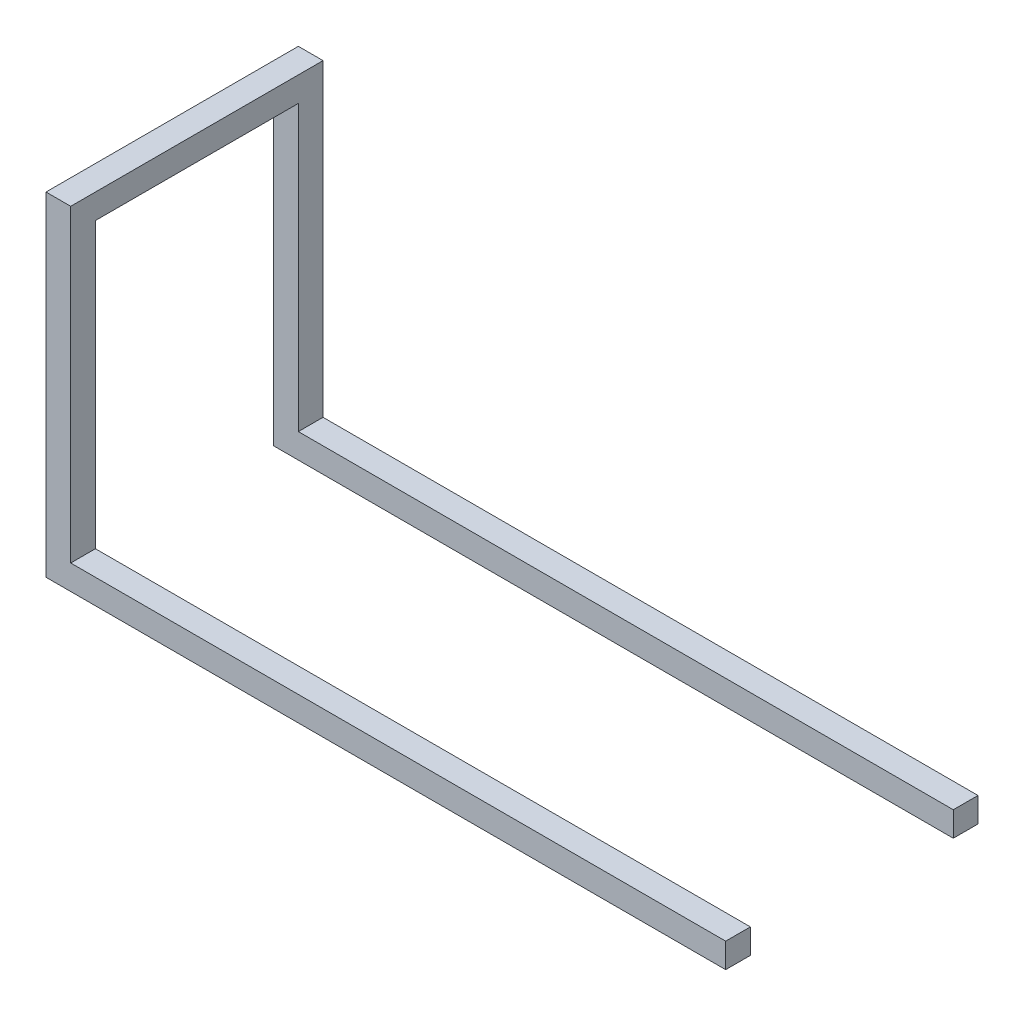
ISO-10303-21;
HEADER;
FILE_DESCRIPTION(('STEP AP214'),'2;1');
FILE_NAME('part.step','',(''),(''),'','','');
FILE_SCHEMA(('AUTOMOTIVE_DESIGN { 1 0 10303 214 1 1 1 1 }'));
ENDSEC;
DATA;
#1=APPLICATION_CONTEXT('core data for automotive mechanical design processes');
#2=APPLICATION_PROTOCOL_DEFINITION('international standard','automotive_design',2000,#1);
#3=PRODUCT_CONTEXT('',#1,'mechanical');
#4=PRODUCT('Part','Part','',(#3));
#5=PRODUCT_RELATED_PRODUCT_CATEGORY('part','',(#4));
#6=PRODUCT_DEFINITION_FORMATION('','',#4);
#7=PRODUCT_DEFINITION_CONTEXT('part definition',#1,'design');
#8=PRODUCT_DEFINITION('design','',#6,#7);
#9=PRODUCT_DEFINITION_SHAPE('','',#8);
#10=(LENGTH_UNIT() NAMED_UNIT(*) SI_UNIT(.MILLI.,.METRE.));
#11=(NAMED_UNIT(*) PLANE_ANGLE_UNIT() SI_UNIT($,.RADIAN.));
#12=(NAMED_UNIT(*) SI_UNIT($,.STERADIAN.) SOLID_ANGLE_UNIT());
#13=UNCERTAINTY_MEASURE_WITH_UNIT(LENGTH_MEASURE(1.E-05),#10,'distance_accuracy_value','');
#14=(GEOMETRIC_REPRESENTATION_CONTEXT(3) GLOBAL_UNCERTAINTY_ASSIGNED_CONTEXT((#13)) GLOBAL_UNIT_ASSIGNED_CONTEXT((#10,
#11,#12)) REPRESENTATION_CONTEXT('',''));
#15=CARTESIAN_POINT('',(0.,0.,0.));
#16=DIRECTION('',(0.,0.,1.));
#17=DIRECTION('',(1.,0.,0.));
#18=AXIS2_PLACEMENT_3D('',#15,#16,#17);
#19=CARTESIAN_POINT('',(0.,0.,164.2));
#20=DIRECTION('',(0.,0.,-1.));
#21=DIRECTION('',(-1.,0.,0.));
#22=AXIS2_PLACEMENT_3D('',#19,#20,#21);
#23=PLANE('',#22);
#24=DIRECTION('',(0.,-1.,0.));
#25=VECTOR('',#24,1.);
#26=CARTESIAN_POINT('',(-515.,500.,164.2));
#27=LINE('',#26,#25);
#28=CARTESIAN_POINT('',(-515.,460.,164.2));
#29=VERTEX_POINT('',#28);
#30=CARTESIAN_POINT('',(-515.,-39.9999999999999,164.2));
#31=VERTEX_POINT('',#30);
#32=EDGE_CURVE('E140',#29,#31,#27,.T.);
#33=ORIENTED_EDGE('',*,*,#32,.F.);
#34=DIRECTION('',(1.,0.,0.));
#35=VECTOR('',#34,1.);
#36=CARTESIAN_POINT('',(0.,460.,164.2));
#37=LINE('',#36,#35);
#38=CARTESIAN_POINT('',(-475.,460.,164.2));
#39=VERTEX_POINT('',#38);
#40=EDGE_CURVE('E54',#29,#39,#37,.T.);
#41=ORIENTED_EDGE('',*,*,#40,.T.);
#42=DIRECTION('',(0.,1.,0.));
#43=VECTOR('',#42,1.);
#44=CARTESIAN_POINT('',(-475.,0.,164.2));
#45=LINE('',#44,#43);
#46=CARTESIAN_POINT('',(-475.,0.,164.2));
#47=VERTEX_POINT('',#46);
#48=EDGE_CURVE('E151',#47,#39,#45,.T.);
#49=ORIENTED_EDGE('',*,*,#48,.F.);
#50=DIRECTION('',(-1.,0.,0.));
#51=VECTOR('',#50,1.);
#52=CARTESIAN_POINT('',(-475.,0.,164.2));
#53=LINE('',#52,#51);
#54=CARTESIAN_POINT('',(585.,0.,164.2));
#55=VERTEX_POINT('',#54);
#56=EDGE_CURVE('E92',#55,#47,#53,.T.);
#57=ORIENTED_EDGE('',*,*,#56,.F.);
#58=DIRECTION('',(0.,1.,0.));
#59=VECTOR('',#58,1.);
#60=CARTESIAN_POINT('',(585.,-39.9999999999999,164.2));
#61=LINE('',#60,#59);
#62=CARTESIAN_POINT('',(585.,-39.9999999999999,164.2));
#63=VERTEX_POINT('',#62);
#64=EDGE_CURVE('E146',#63,#55,#61,.T.);
#65=ORIENTED_EDGE('',*,*,#64,.F.);
#66=DIRECTION('',(1.,0.,0.));
#67=VECTOR('',#66,1.);
#68=CARTESIAN_POINT('',(-515.,-39.9999999999999,164.2));
#69=LINE('',#68,#67);
#70=EDGE_CURVE('E123',#31,#63,#69,.T.);
#71=ORIENTED_EDGE('',*,*,#70,.F.);
#72=EDGE_LOOP('',(#33,#41,#49,#57,#65,#71));
#73=FACE_BOUND('',#72,.T.);
#74=ADVANCED_FACE('F45',(#73),#23,.T.);
#75=CARTESIAN_POINT('',(-515.,500.,204.2));
#76=DIRECTION('',(0.,-1.,0.));
#77=DIRECTION('',(0.,0.,-1.));
#78=AXIS2_PLACEMENT_3D('',#75,#76,#77);
#79=PLANE('',#78);
#80=DIRECTION('',(0.,0.,-1.));
#81=VECTOR('',#80,1.);
#82=CARTESIAN_POINT('',(-475.,500.,204.2));
#83=LINE('',#82,#81);
#84=CARTESIAN_POINT('',(-475.,500.,204.2));
#85=VERTEX_POINT('',#84);
#86=CARTESIAN_POINT('',(-475.,500.,-204.2));
#87=VERTEX_POINT('',#86);
#88=EDGE_CURVE('E165',#85,#87,#83,.T.);
#89=ORIENTED_EDGE('',*,*,#88,.T.);
#90=DIRECTION('',(-1.,0.,0.));
#91=VECTOR('',#90,1.);
#92=CARTESIAN_POINT('',(-475.,500.,-204.2));
#93=LINE('',#92,#91);
#94=CARTESIAN_POINT('',(-515.,500.,-204.2));
#95=VERTEX_POINT('',#94);
#96=EDGE_CURVE('E250',#87,#95,#93,.T.);
#97=ORIENTED_EDGE('',*,*,#96,.T.);
#98=DIRECTION('',(0.,0.,-1.));
#99=VECTOR('',#98,1.);
#100=CARTESIAN_POINT('',(-515.,500.,204.2));
#101=LINE('',#100,#99);
#102=CARTESIAN_POINT('',(-515.,500.,204.2));
#103=VERTEX_POINT('',#102);
#104=EDGE_CURVE('E161',#103,#95,#101,.T.);
#105=ORIENTED_EDGE('',*,*,#104,.F.);
#106=DIRECTION('',(-1.,0.,0.));
#107=VECTOR('',#106,1.);
#108=CARTESIAN_POINT('',(-515.,500.,204.2));
#109=LINE('',#108,#107);
#110=EDGE_CURVE('E262',#85,#103,#109,.T.);
#111=ORIENTED_EDGE('',*,*,#110,.F.);
#112=EDGE_LOOP('',(#89,#97,#105,#111));
#113=FACE_BOUND('',#112,.T.);
#114=ADVANCED_FACE('F47',(#113),#79,.F.);
#115=CARTESIAN_POINT('',(-515.,500.,204.2));
#116=DIRECTION('',(1.,0.,0.));
#117=DIRECTION('',(0.,0.,-1.));
#118=AXIS2_PLACEMENT_3D('',#115,#116,#117);
#119=PLANE('',#118);
#120=ORIENTED_EDGE('',*,*,#104,.T.);
#121=DIRECTION('',(0.,1.,0.));
#122=VECTOR('',#121,1.);
#123=CARTESIAN_POINT('',(-515.,460.,-204.2));
#124=LINE('',#123,#122);
#125=CARTESIAN_POINT('',(-515.,-39.9999999999999,-204.2));
#126=VERTEX_POINT('',#125);
#127=EDGE_CURVE('E143',#126,#95,#124,.T.);
#128=ORIENTED_EDGE('',*,*,#127,.F.);
#129=DIRECTION('',(0.,0.,1.));
#130=VECTOR('',#129,1.);
#131=CARTESIAN_POINT('',(-515.,-39.9999999999999,-204.2));
#132=LINE('',#131,#130);
#133=CARTESIAN_POINT('',(-515.,-39.9999999999999,-164.2));
#134=VERTEX_POINT('',#133);
#135=EDGE_CURVE('E239',#126,#134,#132,.T.);
#136=ORIENTED_EDGE('',*,*,#135,.T.);
#137=DIRECTION('',(0.,-1.,0.));
#138=VECTOR('',#137,1.);
#139=CARTESIAN_POINT('',(-515.,500.,-164.2));
#140=LINE('',#139,#138);
#141=CARTESIAN_POINT('',(-515.,460.,-164.2));
#142=VERTEX_POINT('',#141);
#143=EDGE_CURVE('E228',#142,#134,#140,.T.);
#144=ORIENTED_EDGE('',*,*,#143,.F.);
#145=DIRECTION('',(0.,0.,1.));
#146=VECTOR('',#145,1.);
#147=CARTESIAN_POINT('',(-515.,460.,-204.2));
#148=LINE('',#147,#146);
#149=EDGE_CURVE('E236',#142,#29,#148,.T.);
#150=ORIENTED_EDGE('',*,*,#149,.T.);
#151=ORIENTED_EDGE('',*,*,#32,.T.);
#152=DIRECTION('',(0.,0.,-1.));
#153=VECTOR('',#152,1.);
#154=CARTESIAN_POINT('',(-515.,-39.9999999999999,204.2));
#155=LINE('',#154,#153);
#156=CARTESIAN_POINT('',(-515.,-39.9999999999999,204.2));
#157=VERTEX_POINT('',#156);
#158=EDGE_CURVE('E127',#157,#31,#155,.T.);
#159=ORIENTED_EDGE('',*,*,#158,.F.);
#160=DIRECTION('',(0.,-1.,0.));
#161=VECTOR('',#160,1.);
#162=CARTESIAN_POINT('',(-515.,500.,204.2));
#163=LINE('',#162,#161);
#164=EDGE_CURVE('E113',#103,#157,#163,.T.);
#165=ORIENTED_EDGE('',*,*,#164,.F.);
#166=EDGE_LOOP('',(#120,#128,#136,#144,#150,#151,#159,#165));
#167=FACE_BOUND('',#166,.T.);
#168=ADVANCED_FACE('F195',(#167),#119,.F.);
#169=CARTESIAN_POINT('',(-515.,-39.9999999999999,204.2));
#170=DIRECTION('',(0.,1.,0.));
#171=DIRECTION('',(-1.,0.,0.));
#172=AXIS2_PLACEMENT_3D('',#169,#170,#171);
#173=PLANE('',#172);
#174=ORIENTED_EDGE('',*,*,#70,.T.);
#175=DIRECTION('',(0.,0.,-1.));
#176=VECTOR('',#175,1.);
#177=CARTESIAN_POINT('',(585.,-39.9999999999999,204.2));
#178=LINE('',#177,#176);
#179=CARTESIAN_POINT('',(585.,-39.9999999999999,204.2));
#180=VERTEX_POINT('',#179);
#181=EDGE_CURVE('E120',#180,#63,#178,.T.);
#182=ORIENTED_EDGE('',*,*,#181,.F.);
#183=DIRECTION('',(1.,0.,0.));
#184=VECTOR('',#183,1.);
#185=CARTESIAN_POINT('',(-515.,-39.9999999999999,204.2));
#186=LINE('',#185,#184);
#187=EDGE_CURVE('E106',#157,#180,#186,.T.);
#188=ORIENTED_EDGE('',*,*,#187,.F.);
#189=ORIENTED_EDGE('',*,*,#158,.T.);
#190=EDGE_LOOP('',(#174,#182,#188,#189));
#191=FACE_BOUND('',#190,.T.);
#192=ADVANCED_FACE('F121',(#191),#173,.F.);
#193=CARTESIAN_POINT('',(585.,-39.9999999999999,204.2));
#194=DIRECTION('',(-1.,0.,0.));
#195=DIRECTION('',(0.,0.,1.));
#196=AXIS2_PLACEMENT_3D('',#193,#194,#195);
#197=PLANE('',#196);
#198=ORIENTED_EDGE('',*,*,#64,.T.);
#199=DIRECTION('',(0.,0.,-1.));
#200=VECTOR('',#199,1.);
#201=CARTESIAN_POINT('',(585.,0.,204.2));
#202=LINE('',#201,#200);
#203=CARTESIAN_POINT('',(585.,0.,204.2));
#204=VERTEX_POINT('',#203);
#205=EDGE_CURVE('E128',#204,#55,#202,.T.);
#206=ORIENTED_EDGE('',*,*,#205,.F.);
#207=DIRECTION('',(0.,1.,0.));
#208=VECTOR('',#207,1.);
#209=CARTESIAN_POINT('',(585.,-39.9999999999999,204.2));
#210=LINE('',#209,#208);
#211=EDGE_CURVE('E110',#180,#204,#210,.T.);
#212=ORIENTED_EDGE('',*,*,#211,.F.);
#213=ORIENTED_EDGE('',*,*,#181,.T.);
#214=EDGE_LOOP('',(#198,#206,#212,#213));
#215=FACE_BOUND('',#214,.T.);
#216=ADVANCED_FACE('F130',(#215),#197,.F.);
#217=CARTESIAN_POINT('',(-475.,0.,204.2));
#218=DIRECTION('',(0.,-1.,0.));
#219=DIRECTION('',(0.,0.,-1.));
#220=AXIS2_PLACEMENT_3D('',#217,#218,#219);
#221=PLANE('',#220);
#222=ORIENTED_EDGE('',*,*,#56,.T.);
#223=DIRECTION('',(0.,0.,-1.));
#224=VECTOR('',#223,1.);
#225=CARTESIAN_POINT('',(-475.,0.,204.2));
#226=LINE('',#225,#224);
#227=CARTESIAN_POINT('',(-475.,0.,204.2));
#228=VERTEX_POINT('',#227);
#229=EDGE_CURVE('E136',#228,#47,#226,.T.);
#230=ORIENTED_EDGE('',*,*,#229,.F.);
#231=DIRECTION('',(-1.,0.,0.));
#232=VECTOR('',#231,1.);
#233=CARTESIAN_POINT('',(-475.,0.,204.2));
#234=LINE('',#233,#232);
#235=EDGE_CURVE('E133',#204,#228,#234,.T.);
#236=ORIENTED_EDGE('',*,*,#235,.F.);
#237=ORIENTED_EDGE('',*,*,#205,.T.);
#238=EDGE_LOOP('',(#222,#230,#236,#237));
#239=FACE_BOUND('',#238,.T.);
#240=ADVANCED_FACE('F181',(#239),#221,.F.);
#241=CARTESIAN_POINT('',(-475.,0.,204.2));
#242=DIRECTION('',(-1.,0.,0.));
#243=DIRECTION('',(0.,0.,1.));
#244=AXIS2_PLACEMENT_3D('',#241,#242,#243);
#245=PLANE('',#244);
#246=DIRECTION('',(0.,0.,-1.));
#247=VECTOR('',#246,1.);
#248=CARTESIAN_POINT('',(-475.,460.,204.2));
#249=LINE('',#248,#247);
#250=CARTESIAN_POINT('',(-475.,460.,-164.2));
#251=VERTEX_POINT('',#250);
#252=EDGE_CURVE('E180',#39,#251,#249,.T.);
#253=ORIENTED_EDGE('',*,*,#252,.T.);
#254=DIRECTION('',(0.,1.,0.));
#255=VECTOR('',#254,1.);
#256=CARTESIAN_POINT('',(-475.,0.,-164.2));
#257=LINE('',#256,#255);
#258=CARTESIAN_POINT('',(-475.,0.,-164.2));
#259=VERTEX_POINT('',#258);
#260=EDGE_CURVE('E61',#259,#251,#257,.T.);
#261=ORIENTED_EDGE('',*,*,#260,.F.);
#262=DIRECTION('',(0.,0.,1.));
#263=VECTOR('',#262,1.);
#264=CARTESIAN_POINT('',(-475.,0.,-204.2));
#265=LINE('',#264,#263);
#266=CARTESIAN_POINT('',(-475.,0.,-204.2));
#267=VERTEX_POINT('',#266);
#268=EDGE_CURVE('E294',#267,#259,#265,.T.);
#269=ORIENTED_EDGE('',*,*,#268,.F.);
#270=DIRECTION('',(0.,1.,0.));
#271=VECTOR('',#270,1.);
#272=CARTESIAN_POINT('',(-475.,460.,-204.2));
#273=LINE('',#272,#271);
#274=EDGE_CURVE('E244',#267,#87,#273,.T.);
#275=ORIENTED_EDGE('',*,*,#274,.T.);
#276=ORIENTED_EDGE('',*,*,#88,.F.);
#277=DIRECTION('',(0.,1.,0.));
#278=VECTOR('',#277,1.);
#279=CARTESIAN_POINT('',(-475.,460.,204.2));
#280=LINE('',#279,#278);
#281=EDGE_CURVE('E69',#228,#85,#280,.T.);
#282=ORIENTED_EDGE('',*,*,#281,.F.);
#283=ORIENTED_EDGE('',*,*,#229,.T.);
#284=ORIENTED_EDGE('',*,*,#48,.T.);
#285=EDGE_LOOP('',(#253,#261,#269,#275,#276,#282,#283,#284));
#286=FACE_BOUND('',#285,.T.);
#287=ADVANCED_FACE('F179',(#286),#245,.F.);
#288=CARTESIAN_POINT('',(0.,0.,204.2));
#289=DIRECTION('',(0.,0.,-1.));
#290=DIRECTION('',(-1.,0.,0.));
#291=AXIS2_PLACEMENT_3D('',#288,#289,#290);
#292=PLANE('',#291);
#293=ORIENTED_EDGE('',*,*,#164,.T.);
#294=ORIENTED_EDGE('',*,*,#187,.T.);
#295=ORIENTED_EDGE('',*,*,#211,.T.);
#296=ORIENTED_EDGE('',*,*,#235,.T.);
#297=ORIENTED_EDGE('',*,*,#281,.T.);
#298=ORIENTED_EDGE('',*,*,#110,.T.);
#299=EDGE_LOOP('',(#293,#294,#295,#296,#297,#298));
#300=FACE_BOUND('',#299,.T.);
#301=ADVANCED_FACE('F108',(#300),#292,.F.);
#302=CARTESIAN_POINT('',(-475.,460.,-204.2));
#303=DIRECTION('',(0.,0.,-1.));
#304=DIRECTION('',(-1.,0.,0.));
#305=AXIS2_PLACEMENT_3D('',#302,#303,#304);
#306=PLANE('',#305);
#307=ORIENTED_EDGE('',*,*,#96,.F.);
#308=ORIENTED_EDGE('',*,*,#274,.F.);
#309=DIRECTION('',(-1.,0.,0.));
#310=VECTOR('',#309,1.);
#311=CARTESIAN_POINT('',(-475.,0.,-204.2));
#312=LINE('',#311,#310);
#313=CARTESIAN_POINT('',(585.,0.,-204.2));
#314=VERTEX_POINT('',#313);
#315=EDGE_CURVE('E298',#314,#267,#312,.T.);
#316=ORIENTED_EDGE('',*,*,#315,.F.);
#317=DIRECTION('',(0.,1.,0.));
#318=VECTOR('',#317,1.);
#319=CARTESIAN_POINT('',(585.,-39.9999999999999,-204.2));
#320=LINE('',#319,#318);
#321=CARTESIAN_POINT('',(585.,-39.9999999999999,-204.2));
#322=VERTEX_POINT('',#321);
#323=EDGE_CURVE('E278',#322,#314,#320,.T.);
#324=ORIENTED_EDGE('',*,*,#323,.F.);
#325=DIRECTION('',(1.,0.,0.));
#326=VECTOR('',#325,1.);
#327=CARTESIAN_POINT('',(-515.,-39.9999999999999,-204.2));
#328=LINE('',#327,#326);
#329=EDGE_CURVE('E274',#126,#322,#328,.T.);
#330=ORIENTED_EDGE('',*,*,#329,.F.);
#331=ORIENTED_EDGE('',*,*,#127,.T.);
#332=EDGE_LOOP('',(#307,#308,#316,#324,#330,#331));
#333=FACE_BOUND('',#332,.T.);
#334=ADVANCED_FACE('F200',(#333),#306,.T.);
#335=CARTESIAN_POINT('',(0.,460.,0.));
#336=DIRECTION('',(0.,1.,0.));
#337=DIRECTION('',(0.,0.,1.));
#338=AXIS2_PLACEMENT_3D('',#335,#336,#337);
#339=PLANE('',#338);
#340=ORIENTED_EDGE('',*,*,#149,.F.);
#341=DIRECTION('',(1.,0.,0.));
#342=VECTOR('',#341,1.);
#343=CARTESIAN_POINT('',(0.,460.,-164.2));
#344=LINE('',#343,#342);
#345=EDGE_CURVE('E11',#142,#251,#344,.T.);
#346=ORIENTED_EDGE('',*,*,#345,.T.);
#347=ORIENTED_EDGE('',*,*,#252,.F.);
#348=ORIENTED_EDGE('',*,*,#40,.F.);
#349=EDGE_LOOP('',(#340,#346,#347,#348));
#350=FACE_BOUND('',#349,.T.);
#351=ADVANCED_FACE('F203',(#350),#339,.F.);
#352=CARTESIAN_POINT('',(0.,0.,-164.2));
#353=DIRECTION('',(0.,0.,1.));
#354=DIRECTION('',(-1.,0.,0.));
#355=AXIS2_PLACEMENT_3D('',#352,#353,#354);
#356=PLANE('',#355);
#357=ORIENTED_EDGE('',*,*,#345,.F.);
#358=ORIENTED_EDGE('',*,*,#143,.T.);
#359=DIRECTION('',(1.,0.,0.));
#360=VECTOR('',#359,1.);
#361=CARTESIAN_POINT('',(-515.,-39.9999999999999,-164.2));
#362=LINE('',#361,#360);
#363=CARTESIAN_POINT('',(585.,-39.9999999999999,-164.2));
#364=VERTEX_POINT('',#363);
#365=EDGE_CURVE('E241',#134,#364,#362,.T.);
#366=ORIENTED_EDGE('',*,*,#365,.T.);
#367=DIRECTION('',(0.,1.,0.));
#368=VECTOR('',#367,1.);
#369=CARTESIAN_POINT('',(585.,-39.9999999999999,-164.2));
#370=LINE('',#369,#368);
#371=CARTESIAN_POINT('',(585.,0.,-164.2));
#372=VERTEX_POINT('',#371);
#373=EDGE_CURVE('E304',#364,#372,#370,.T.);
#374=ORIENTED_EDGE('',*,*,#373,.T.);
#375=DIRECTION('',(-1.,0.,0.));
#376=VECTOR('',#375,1.);
#377=CARTESIAN_POINT('',(-475.,0.,-164.2));
#378=LINE('',#377,#376);
#379=EDGE_CURVE('E301',#372,#259,#378,.T.);
#380=ORIENTED_EDGE('',*,*,#379,.T.);
#381=ORIENTED_EDGE('',*,*,#260,.T.);
#382=EDGE_LOOP('',(#357,#358,#366,#374,#380,#381));
#383=FACE_BOUND('',#382,.T.);
#384=ADVANCED_FACE('F207',(#383),#356,.T.);
#385=CARTESIAN_POINT('',(-515.,-39.9999999999999,-204.2));
#386=DIRECTION('',(0.,1.,0.));
#387=DIRECTION('',(-1.,0.,0.));
#388=AXIS2_PLACEMENT_3D('',#385,#386,#387);
#389=PLANE('',#388);
#390=ORIENTED_EDGE('',*,*,#365,.F.);
#391=ORIENTED_EDGE('',*,*,#135,.F.);
#392=ORIENTED_EDGE('',*,*,#329,.T.);
#393=DIRECTION('',(0.,0.,1.));
#394=VECTOR('',#393,1.);
#395=CARTESIAN_POINT('',(585.,-39.9999999999999,-204.2));
#396=LINE('',#395,#394);
#397=EDGE_CURVE('E286',#322,#364,#396,.T.);
#398=ORIENTED_EDGE('',*,*,#397,.T.);
#399=EDGE_LOOP('',(#390,#391,#392,#398));
#400=FACE_BOUND('',#399,.T.);
#401=ADVANCED_FACE('F208',(#400),#389,.F.);
#402=CARTESIAN_POINT('',(585.,-39.9999999999999,-204.2));
#403=DIRECTION('',(-1.,0.,0.));
#404=DIRECTION('',(0.,0.,-1.));
#405=AXIS2_PLACEMENT_3D('',#402,#403,#404);
#406=PLANE('',#405);
#407=ORIENTED_EDGE('',*,*,#373,.F.);
#408=ORIENTED_EDGE('',*,*,#397,.F.);
#409=ORIENTED_EDGE('',*,*,#323,.T.);
#410=DIRECTION('',(0.,0.,1.));
#411=VECTOR('',#410,1.);
#412=CARTESIAN_POINT('',(585.,0.,-204.2));
#413=LINE('',#412,#411);
#414=EDGE_CURVE('E288',#314,#372,#413,.T.);
#415=ORIENTED_EDGE('',*,*,#414,.T.);
#416=EDGE_LOOP('',(#407,#408,#409,#415));
#417=FACE_BOUND('',#416,.T.);
#418=ADVANCED_FACE('F211',(#417),#406,.F.);
#419=CARTESIAN_POINT('',(-475.,0.,-204.2));
#420=DIRECTION('',(0.,-1.,0.));
#421=DIRECTION('',(0.,0.,1.));
#422=AXIS2_PLACEMENT_3D('',#419,#420,#421);
#423=PLANE('',#422);
#424=ORIENTED_EDGE('',*,*,#379,.F.);
#425=ORIENTED_EDGE('',*,*,#414,.F.);
#426=ORIENTED_EDGE('',*,*,#315,.T.);
#427=ORIENTED_EDGE('',*,*,#268,.T.);
#428=EDGE_LOOP('',(#424,#425,#426,#427));
#429=FACE_BOUND('',#428,.T.);
#430=ADVANCED_FACE('F215',(#429),#423,.F.);
#431=CLOSED_SHELL('',(#74,#114,#168,#192,#216,#240,#287,#301,#334,#351,#384,#401,#418,#430));
#432=MANIFOLD_SOLID_BREP('B2',#431);
#433=ADVANCED_BREP_SHAPE_REPRESENTATION('',(#18,#432),#14);
#434=SHAPE_DEFINITION_REPRESENTATION(#9,#433);
ENDSEC;
END-ISO-10303-21;
